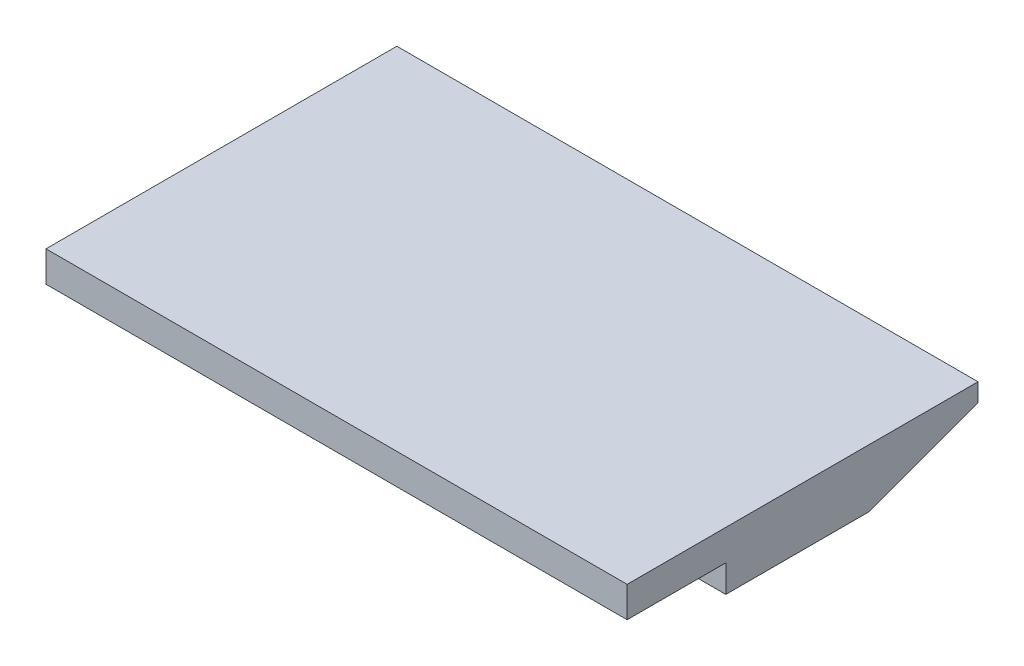
ISO-10303-21;
HEADER;
FILE_DESCRIPTION(('STEP AP214'),'2;1');
FILE_NAME('part.step','',(''),(''),'','','');
FILE_SCHEMA(('AUTOMOTIVE_DESIGN { 1 0 10303 214 1 1 1 1 }'));
ENDSEC;
DATA;
#1=APPLICATION_CONTEXT('core data for automotive mechanical design processes');
#2=APPLICATION_PROTOCOL_DEFINITION('international standard','automotive_design',2000,#1);
#3=PRODUCT_CONTEXT('',#1,'mechanical');
#4=PRODUCT('Part','Part','',(#3));
#5=PRODUCT_RELATED_PRODUCT_CATEGORY('part','',(#4));
#6=PRODUCT_DEFINITION_FORMATION('','',#4);
#7=PRODUCT_DEFINITION_CONTEXT('part definition',#1,'design');
#8=PRODUCT_DEFINITION('design','',#6,#7);
#9=PRODUCT_DEFINITION_SHAPE('','',#8);
#10=(LENGTH_UNIT() NAMED_UNIT(*) SI_UNIT(.MILLI.,.METRE.));
#11=(NAMED_UNIT(*) PLANE_ANGLE_UNIT() SI_UNIT($,.RADIAN.));
#12=(NAMED_UNIT(*) SI_UNIT($,.STERADIAN.) SOLID_ANGLE_UNIT());
#13=UNCERTAINTY_MEASURE_WITH_UNIT(LENGTH_MEASURE(1.E-05),#10,'distance_accuracy_value','');
#14=(GEOMETRIC_REPRESENTATION_CONTEXT(3) GLOBAL_UNCERTAINTY_ASSIGNED_CONTEXT((#13)) GLOBAL_UNIT_ASSIGNED_CONTEXT((#10,
#11,#12)) REPRESENTATION_CONTEXT('',''));
#15=CARTESIAN_POINT('',(0.,0.,0.));
#16=DIRECTION('',(0.,0.,1.));
#17=DIRECTION('',(1.,0.,0.));
#18=AXIS2_PLACEMENT_3D('',#15,#16,#17);
#19=CARTESIAN_POINT('',(265.,53.,160.));
#20=DIRECTION('',(-1.,0.,0.));
#21=DIRECTION('',(0.,0.,1.));
#22=AXIS2_PLACEMENT_3D('',#19,#20,#21);
#23=PLANE('',#22);
#24=DIRECTION('',(0.,-1.,0.));
#25=VECTOR('',#24,1.);
#26=CARTESIAN_POINT('',(265.,53.,160.));
#27=LINE('',#26,#25);
#28=CARTESIAN_POINT('',(265.,53.,160.));
#29=VERTEX_POINT('',#28);
#30=CARTESIAN_POINT('',(265.,25.,160.));
#31=VERTEX_POINT('',#30);
#32=EDGE_CURVE('E126',#29,#31,#27,.T.);
#33=ORIENTED_EDGE('',*,*,#32,.T.);
#34=DIRECTION('',(0.,0.,1.));
#35=VECTOR('',#34,1.);
#36=CARTESIAN_POINT('',(265.,25.,70.0000000000001));
#37=LINE('',#36,#35);
#38=CARTESIAN_POINT('',(265.,25.,70.0000000000001));
#39=VERTEX_POINT('',#38);
#40=EDGE_CURVE('E110',#39,#31,#37,.T.);
#41=ORIENTED_EDGE('',*,*,#40,.F.);
#42=DIRECTION('',(0.,1.,0.));
#43=VECTOR('',#42,1.);
#44=CARTESIAN_POINT('',(265.,0.,70.0000000000001));
#45=LINE('',#44,#43);
#46=CARTESIAN_POINT('',(265.,0.,70.0000000000001));
#47=VERTEX_POINT('',#46);
#48=EDGE_CURVE('E92',#47,#39,#45,.T.);
#49=ORIENTED_EDGE('',*,*,#48,.F.);
#50=DIRECTION('',(0.,0.,-1.));
#51=VECTOR('',#50,1.);
#52=CARTESIAN_POINT('',(265.,0.,160.));
#53=LINE('',#52,#51);
#54=CARTESIAN_POINT('',(265.,0.,-59.9999999999991));
#55=VERTEX_POINT('',#54);
#56=EDGE_CURVE('E54',#47,#55,#53,.T.);
#57=ORIENTED_EDGE('',*,*,#56,.T.);
#58=DIRECTION('',(0.,0.342020143325666,-0.939692620785909));
#59=VECTOR('',#58,1.);
#60=CARTESIAN_POINT('',(265.,36.3970234266203,-160.));
#61=LINE('',#60,#59);
#62=CARTESIAN_POINT('',(265.,36.3970234266203,-160.));
#63=VERTEX_POINT('',#62);
#64=EDGE_CURVE('E11',#55,#63,#61,.T.);
#65=ORIENTED_EDGE('',*,*,#64,.T.);
#66=DIRECTION('',(0.,-1.,0.));
#67=VECTOR('',#66,1.);
#68=CARTESIAN_POINT('',(265.,53.,-160.));
#69=LINE('',#68,#67);
#70=CARTESIAN_POINT('',(265.,53.,-160.));
#71=VERTEX_POINT('',#70);
#72=EDGE_CURVE('E136',#71,#63,#69,.T.);
#73=ORIENTED_EDGE('',*,*,#72,.F.);
#74=DIRECTION('',(0.,0.,-1.));
#75=VECTOR('',#74,1.);
#76=CARTESIAN_POINT('',(265.,53.,160.));
#77=LINE('',#76,#75);
#78=EDGE_CURVE('E117',#29,#71,#77,.T.);
#79=ORIENTED_EDGE('',*,*,#78,.F.);
#80=EDGE_LOOP('',(#33,#41,#49,#57,#65,#73,#79));
#81=FACE_BOUND('',#80,.T.);
#82=ADVANCED_FACE('F32',(#81),#23,.F.);
#83=CARTESIAN_POINT('',(-265.,53.,-160.));
#84=DIRECTION('',(0.,0.,1.));
#85=DIRECTION('',(1.,0.,0.));
#86=AXIS2_PLACEMENT_3D('',#83,#84,#85);
#87=PLANE('',#86);
#88=ORIENTED_EDGE('',*,*,#72,.T.);
#89=DIRECTION('',(-1.,0.,0.));
#90=VECTOR('',#89,1.);
#91=CARTESIAN_POINT('',(-265.,36.3970234266203,-160.));
#92=LINE('',#91,#90);
#93=CARTESIAN_POINT('',(-265.,36.3970234266203,-160.));
#94=VERTEX_POINT('',#93);
#95=EDGE_CURVE('E139',#63,#94,#92,.T.);
#96=ORIENTED_EDGE('',*,*,#95,.T.);
#97=DIRECTION('',(0.,-1.,0.));
#98=VECTOR('',#97,1.);
#99=CARTESIAN_POINT('',(-265.,53.,-160.));
#100=LINE('',#99,#98);
#101=CARTESIAN_POINT('',(-265.,53.,-160.));
#102=VERTEX_POINT('',#101);
#103=EDGE_CURVE('E133',#102,#94,#100,.T.);
#104=ORIENTED_EDGE('',*,*,#103,.F.);
#105=DIRECTION('',(-1.,0.,0.));
#106=VECTOR('',#105,1.);
#107=CARTESIAN_POINT('',(-265.,53.,-160.));
#108=LINE('',#107,#106);
#109=EDGE_CURVE('E120',#71,#102,#108,.T.);
#110=ORIENTED_EDGE('',*,*,#109,.F.);
#111=EDGE_LOOP('',(#88,#96,#104,#110));
#112=FACE_BOUND('',#111,.T.);
#113=ADVANCED_FACE('F152',(#112),#87,.F.);
#114=CARTESIAN_POINT('',(-265.,53.,160.));
#115=DIRECTION('',(1.,0.,0.));
#116=DIRECTION('',(0.,0.,-1.));
#117=AXIS2_PLACEMENT_3D('',#114,#115,#116);
#118=PLANE('',#117);
#119=DIRECTION('',(0.,1.,0.));
#120=VECTOR('',#119,1.);
#121=CARTESIAN_POINT('',(-265.,0.,70.0000000000001));
#122=LINE('',#121,#120);
#123=CARTESIAN_POINT('',(-265.,0.,70.0000000000001));
#124=VERTEX_POINT('',#123);
#125=CARTESIAN_POINT('',(-265.,25.,70.0000000000001));
#126=VERTEX_POINT('',#125);
#127=EDGE_CURVE('E47',#124,#126,#122,.T.);
#128=ORIENTED_EDGE('',*,*,#127,.T.);
#129=DIRECTION('',(0.,0.,1.));
#130=VECTOR('',#129,1.);
#131=CARTESIAN_POINT('',(-265.,25.,70.0000000000001));
#132=LINE('',#131,#130);
#133=CARTESIAN_POINT('',(-265.,25.,160.));
#134=VERTEX_POINT('',#133);
#135=EDGE_CURVE('E99',#126,#134,#132,.T.);
#136=ORIENTED_EDGE('',*,*,#135,.T.);
#137=DIRECTION('',(0.,-1.,0.));
#138=VECTOR('',#137,1.);
#139=CARTESIAN_POINT('',(-265.,53.,160.));
#140=LINE('',#139,#138);
#141=CARTESIAN_POINT('',(-265.,53.,160.));
#142=VERTEX_POINT('',#141);
#143=EDGE_CURVE('E131',#142,#134,#140,.T.);
#144=ORIENTED_EDGE('',*,*,#143,.F.);
#145=DIRECTION('',(0.,0.,1.));
#146=VECTOR('',#145,1.);
#147=CARTESIAN_POINT('',(-265.,53.,160.));
#148=LINE('',#147,#146);
#149=EDGE_CURVE('E122',#102,#142,#148,.T.);
#150=ORIENTED_EDGE('',*,*,#149,.F.);
#151=ORIENTED_EDGE('',*,*,#103,.T.);
#152=DIRECTION('',(0.,-0.342020143325666,0.939692620785909));
#153=VECTOR('',#152,1.);
#154=CARTESIAN_POINT('',(-265.,36.3970234266203,-160.));
#155=LINE('',#154,#153);
#156=CARTESIAN_POINT('',(-265.,0.,-59.9999999999991));
#157=VERTEX_POINT('',#156);
#158=EDGE_CURVE('E142',#94,#157,#155,.T.);
#159=ORIENTED_EDGE('',*,*,#158,.T.);
#160=DIRECTION('',(0.,0.,1.));
#161=VECTOR('',#160,1.);
#162=CARTESIAN_POINT('',(-265.,0.,160.));
#163=LINE('',#162,#161);
#164=EDGE_CURVE('E109',#157,#124,#163,.T.);
#165=ORIENTED_EDGE('',*,*,#164,.T.);
#166=EDGE_LOOP('',(#128,#136,#144,#150,#151,#159,#165));
#167=FACE_BOUND('',#166,.T.);
#168=ADVANCED_FACE('F107',(#167),#118,.F.);
#169=CARTESIAN_POINT('',(-265.,53.,160.));
#170=DIRECTION('',(0.,0.,-1.));
#171=DIRECTION('',(-1.,0.,0.));
#172=AXIS2_PLACEMENT_3D('',#169,#170,#171);
#173=PLANE('',#172);
#174=ORIENTED_EDGE('',*,*,#143,.T.);
#175=DIRECTION('',(1.,0.,0.));
#176=VECTOR('',#175,1.);
#177=CARTESIAN_POINT('',(-265.,25.,160.));
#178=LINE('',#177,#176);
#179=EDGE_CURVE('E95',#134,#31,#178,.T.);
#180=ORIENTED_EDGE('',*,*,#179,.T.);
#181=ORIENTED_EDGE('',*,*,#32,.F.);
#182=DIRECTION('',(1.,0.,0.));
#183=VECTOR('',#182,1.);
#184=CARTESIAN_POINT('',(-265.,53.,160.));
#185=LINE('',#184,#183);
#186=EDGE_CURVE('E124',#142,#29,#185,.T.);
#187=ORIENTED_EDGE('',*,*,#186,.F.);
#188=EDGE_LOOP('',(#174,#180,#181,#187));
#189=FACE_BOUND('',#188,.T.);
#190=ADVANCED_FACE('F160',(#189),#173,.F.);
#191=CARTESIAN_POINT('',(0.,53.,0.));
#192=DIRECTION('',(0.,-1.,0.));
#193=DIRECTION('',(0.,0.,-1.));
#194=AXIS2_PLACEMENT_3D('',#191,#192,#193);
#195=PLANE('',#194);
#196=ORIENTED_EDGE('',*,*,#78,.T.);
#197=ORIENTED_EDGE('',*,*,#109,.T.);
#198=ORIENTED_EDGE('',*,*,#149,.T.);
#199=ORIENTED_EDGE('',*,*,#186,.T.);
#200=EDGE_LOOP('',(#196,#197,#198,#199));
#201=FACE_BOUND('',#200,.T.);
#202=ADVANCED_FACE('F156',(#201),#195,.F.);
#203=CARTESIAN_POINT('',(0.,0.,0.));
#204=DIRECTION('',(0.,-1.,0.));
#205=DIRECTION('',(0.,0.,-1.));
#206=AXIS2_PLACEMENT_3D('',#203,#204,#205);
#207=PLANE('',#206);
#208=DIRECTION('',(1.,0.,0.));
#209=VECTOR('',#208,1.);
#210=CARTESIAN_POINT('',(-265.,0.,70.0000000000001));
#211=LINE('',#210,#209);
#212=EDGE_CURVE('E96',#124,#47,#211,.T.);
#213=ORIENTED_EDGE('',*,*,#212,.F.);
#214=ORIENTED_EDGE('',*,*,#164,.F.);
#215=DIRECTION('',(1.,0.,0.));
#216=VECTOR('',#215,1.);
#217=CARTESIAN_POINT('',(265.,0.,-59.9999999999991));
#218=LINE('',#217,#216);
#219=EDGE_CURVE('E40',#157,#55,#218,.T.);
#220=ORIENTED_EDGE('',*,*,#219,.T.);
#221=ORIENTED_EDGE('',*,*,#56,.F.);
#222=EDGE_LOOP('',(#213,#214,#220,#221));
#223=FACE_BOUND('',#222,.T.);
#224=ADVANCED_FACE('F146',(#223),#207,.T.);
#225=CARTESIAN_POINT('',(-265.,36.3970234266203,-160.));
#226=DIRECTION('',(0.,-0.939692620785909,-0.342020143325666));
#227=DIRECTION('',(1.,0.,0.));
#228=AXIS2_PLACEMENT_3D('',#225,#226,#227);
#229=PLANE('',#228);
#230=ORIENTED_EDGE('',*,*,#64,.F.);
#231=ORIENTED_EDGE('',*,*,#219,.F.);
#232=ORIENTED_EDGE('',*,*,#158,.F.);
#233=ORIENTED_EDGE('',*,*,#95,.F.);
#234=EDGE_LOOP('',(#230,#231,#232,#233));
#235=FACE_BOUND('',#234,.T.);
#236=ADVANCED_FACE('F34',(#235),#229,.T.);
#237=CARTESIAN_POINT('',(-265.,25.,70.0000000000001));
#238=DIRECTION('',(0.,1.,0.));
#239=DIRECTION('',(0.,0.,1.));
#240=AXIS2_PLACEMENT_3D('',#237,#238,#239);
#241=PLANE('',#240);
#242=ORIENTED_EDGE('',*,*,#40,.T.);
#243=ORIENTED_EDGE('',*,*,#179,.F.);
#244=ORIENTED_EDGE('',*,*,#135,.F.);
#245=DIRECTION('',(1.,0.,0.));
#246=VECTOR('',#245,1.);
#247=CARTESIAN_POINT('',(-265.,25.,70.0000000000001));
#248=LINE('',#247,#246);
#249=EDGE_CURVE('E89',#126,#39,#248,.T.);
#250=ORIENTED_EDGE('',*,*,#249,.T.);
#251=EDGE_LOOP('',(#242,#243,#244,#250));
#252=FACE_BOUND('',#251,.T.);
#253=ADVANCED_FACE('F100',(#252),#241,.F.);
#254=CARTESIAN_POINT('',(-265.,0.,70.0000000000001));
#255=DIRECTION('',(0.,0.,-1.));
#256=DIRECTION('',(-1.,0.,0.));
#257=AXIS2_PLACEMENT_3D('',#254,#255,#256);
#258=PLANE('',#257);
#259=ORIENTED_EDGE('',*,*,#48,.T.);
#260=ORIENTED_EDGE('',*,*,#249,.F.);
#261=ORIENTED_EDGE('',*,*,#127,.F.);
#262=ORIENTED_EDGE('',*,*,#212,.T.);
#263=EDGE_LOOP('',(#259,#260,#261,#262));
#264=FACE_BOUND('',#263,.T.);
#265=ADVANCED_FACE('F91',(#264),#258,.F.);
#266=CLOSED_SHELL('',(#82,#113,#168,#190,#202,#224,#236,#253,#265));
#267=MANIFOLD_SOLID_BREP('B2',#266);
#268=ADVANCED_BREP_SHAPE_REPRESENTATION('',(#18,#267),#14);
#269=SHAPE_DEFINITION_REPRESENTATION(#9,#268);
ENDSEC;
END-ISO-10303-21;
